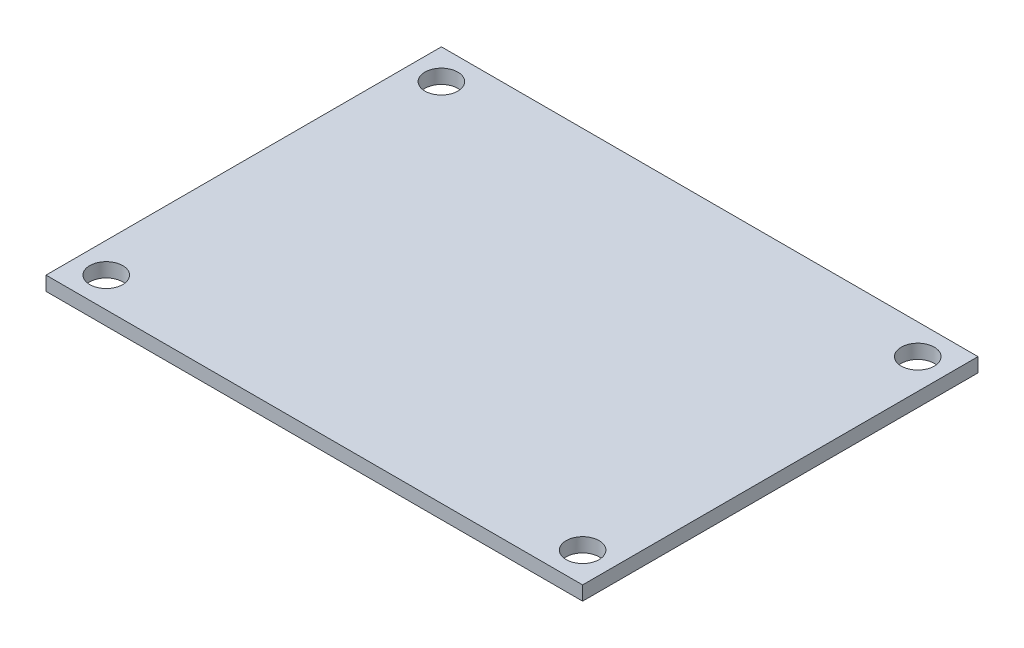
ISO-10303-21;
HEADER;
FILE_DESCRIPTION(('STEP AP214'),'2;1');
FILE_NAME('part.step','',(''),(''),'','','');
FILE_SCHEMA(('AUTOMOTIVE_DESIGN { 1 0 10303 214 1 1 1 1 }'));
ENDSEC;
DATA;
#1=APPLICATION_CONTEXT('core data for automotive mechanical design processes');
#2=APPLICATION_PROTOCOL_DEFINITION('international standard','automotive_design',2000,#1);
#3=PRODUCT_CONTEXT('',#1,'mechanical');
#4=PRODUCT('Part','Part','',(#3));
#5=PRODUCT_RELATED_PRODUCT_CATEGORY('part','',(#4));
#6=PRODUCT_DEFINITION_FORMATION('','',#4);
#7=PRODUCT_DEFINITION_CONTEXT('part definition',#1,'design');
#8=PRODUCT_DEFINITION('design','',#6,#7);
#9=PRODUCT_DEFINITION_SHAPE('','',#8);
#10=(LENGTH_UNIT() NAMED_UNIT(*) SI_UNIT(.MILLI.,.METRE.));
#11=(NAMED_UNIT(*) PLANE_ANGLE_UNIT() SI_UNIT($,.RADIAN.));
#12=(NAMED_UNIT(*) SI_UNIT($,.STERADIAN.) SOLID_ANGLE_UNIT());
#13=UNCERTAINTY_MEASURE_WITH_UNIT(LENGTH_MEASURE(1.E-05),#10,'distance_accuracy_value','');
#14=(GEOMETRIC_REPRESENTATION_CONTEXT(3) GLOBAL_UNCERTAINTY_ASSIGNED_CONTEXT((#13)) GLOBAL_UNIT_ASSIGNED_CONTEXT((#10,
#11,#12)) REPRESENTATION_CONTEXT('',''));
#15=CARTESIAN_POINT('',(0.,0.,0.));
#16=DIRECTION('',(0.,0.,1.));
#17=DIRECTION('',(1.,0.,0.));
#18=AXIS2_PLACEMENT_3D('',#15,#16,#17);
#19=CARTESIAN_POINT('',(28.5,1.5,21.));
#20=DIRECTION('',(-1.,0.,0.));
#21=DIRECTION('',(0.,0.,1.));
#22=AXIS2_PLACEMENT_3D('',#19,#20,#21);
#23=PLANE('',#22);
#24=DIRECTION('',(0.,0.,-1.));
#25=VECTOR('',#24,1.);
#26=CARTESIAN_POINT('',(28.5,0.,21.));
#27=LINE('',#26,#25);
#28=CARTESIAN_POINT('',(28.5,0.,21.));
#29=VERTEX_POINT('',#28);
#30=CARTESIAN_POINT('',(28.5,0.,-21.));
#31=VERTEX_POINT('',#30);
#32=EDGE_CURVE('E99',#29,#31,#27,.T.);
#33=ORIENTED_EDGE('',*,*,#32,.T.);
#34=DIRECTION('',(0.,-1.,0.));
#35=VECTOR('',#34,1.);
#36=CARTESIAN_POINT('',(28.5,1.5,-21.));
#37=LINE('',#36,#35);
#38=CARTESIAN_POINT('',(28.5,1.5,-21.));
#39=VERTEX_POINT('',#38);
#40=EDGE_CURVE('E11',#39,#31,#37,.T.);
#41=ORIENTED_EDGE('',*,*,#40,.F.);
#42=DIRECTION('',(0.,0.,-1.));
#43=VECTOR('',#42,1.);
#44=CARTESIAN_POINT('',(28.5,1.5,21.));
#45=LINE('',#44,#43);
#46=CARTESIAN_POINT('',(28.5,1.5,21.));
#47=VERTEX_POINT('',#46);
#48=EDGE_CURVE('E86',#47,#39,#45,.T.);
#49=ORIENTED_EDGE('',*,*,#48,.F.);
#50=DIRECTION('',(0.,-1.,0.));
#51=VECTOR('',#50,1.);
#52=CARTESIAN_POINT('',(28.5,1.5,21.));
#53=LINE('',#52,#51);
#54=EDGE_CURVE('E95',#47,#29,#53,.T.);
#55=ORIENTED_EDGE('',*,*,#54,.T.);
#56=EDGE_LOOP('',(#33,#41,#49,#55));
#57=FACE_BOUND('',#56,.T.);
#58=ADVANCED_FACE('F33',(#57),#23,.F.);
#59=CARTESIAN_POINT('',(-28.5,1.5,-21.));
#60=DIRECTION('',(0.,0.,1.));
#61=DIRECTION('',(1.,0.,0.));
#62=AXIS2_PLACEMENT_3D('',#59,#60,#61);
#63=PLANE('',#62);
#64=DIRECTION('',(-1.,0.,0.));
#65=VECTOR('',#64,1.);
#66=CARTESIAN_POINT('',(-28.5,0.,-21.));
#67=LINE('',#66,#65);
#68=CARTESIAN_POINT('',(-28.5,0.,-21.));
#69=VERTEX_POINT('',#68);
#70=EDGE_CURVE('E90',#31,#69,#67,.T.);
#71=ORIENTED_EDGE('',*,*,#70,.T.);
#72=DIRECTION('',(0.,-1.,0.));
#73=VECTOR('',#72,1.);
#74=CARTESIAN_POINT('',(-28.5,1.5,-21.));
#75=LINE('',#74,#73);
#76=CARTESIAN_POINT('',(-28.5,1.5,-21.));
#77=VERTEX_POINT('',#76);
#78=EDGE_CURVE('E42',#77,#69,#75,.T.);
#79=ORIENTED_EDGE('',*,*,#78,.F.);
#80=DIRECTION('',(-1.,0.,0.));
#81=VECTOR('',#80,1.);
#82=CARTESIAN_POINT('',(-28.5,1.5,-21.));
#83=LINE('',#82,#81);
#84=EDGE_CURVE('E81',#39,#77,#83,.T.);
#85=ORIENTED_EDGE('',*,*,#84,.F.);
#86=ORIENTED_EDGE('',*,*,#40,.T.);
#87=EDGE_LOOP('',(#71,#79,#85,#86));
#88=FACE_BOUND('',#87,.T.);
#89=ADVANCED_FACE('F89',(#88),#63,.F.);
#90=CARTESIAN_POINT('',(-28.5,1.5,21.));
#91=DIRECTION('',(1.,0.,0.));
#92=DIRECTION('',(0.,0.,-1.));
#93=AXIS2_PLACEMENT_3D('',#90,#91,#92);
#94=PLANE('',#93);
#95=DIRECTION('',(0.,0.,1.));
#96=VECTOR('',#95,1.);
#97=CARTESIAN_POINT('',(-28.5,0.,21.));
#98=LINE('',#97,#96);
#99=CARTESIAN_POINT('',(-28.5,0.,21.));
#100=VERTEX_POINT('',#99);
#101=EDGE_CURVE('E68',#69,#100,#98,.T.);
#102=ORIENTED_EDGE('',*,*,#101,.T.);
#103=DIRECTION('',(0.,-1.,0.));
#104=VECTOR('',#103,1.);
#105=CARTESIAN_POINT('',(-28.5,1.5,21.));
#106=LINE('',#105,#104);
#107=CARTESIAN_POINT('',(-28.5,1.5,21.));
#108=VERTEX_POINT('',#107);
#109=EDGE_CURVE('E91',#108,#100,#106,.T.);
#110=ORIENTED_EDGE('',*,*,#109,.F.);
#111=DIRECTION('',(0.,0.,1.));
#112=VECTOR('',#111,1.);
#113=CARTESIAN_POINT('',(-28.5,1.5,21.));
#114=LINE('',#113,#112);
#115=EDGE_CURVE('E84',#77,#108,#114,.T.);
#116=ORIENTED_EDGE('',*,*,#115,.F.);
#117=ORIENTED_EDGE('',*,*,#78,.T.);
#118=EDGE_LOOP('',(#102,#110,#116,#117));
#119=FACE_BOUND('',#118,.T.);
#120=ADVANCED_FACE('F93',(#119),#94,.F.);
#121=CARTESIAN_POINT('',(-28.5,1.5,21.));
#122=DIRECTION('',(0.,0.,-1.));
#123=DIRECTION('',(-1.,0.,0.));
#124=AXIS2_PLACEMENT_3D('',#121,#122,#123);
#125=PLANE('',#124);
#126=DIRECTION('',(1.,0.,0.));
#127=VECTOR('',#126,1.);
#128=CARTESIAN_POINT('',(-28.5,0.,21.));
#129=LINE('',#128,#127);
#130=EDGE_CURVE('E74',#100,#29,#129,.T.);
#131=ORIENTED_EDGE('',*,*,#130,.T.);
#132=ORIENTED_EDGE('',*,*,#54,.F.);
#133=DIRECTION('',(1.,0.,0.));
#134=VECTOR('',#133,1.);
#135=CARTESIAN_POINT('',(-28.5,1.5,21.));
#136=LINE('',#135,#134);
#137=EDGE_CURVE('E51',#108,#47,#136,.T.);
#138=ORIENTED_EDGE('',*,*,#137,.F.);
#139=ORIENTED_EDGE('',*,*,#109,.T.);
#140=EDGE_LOOP('',(#131,#132,#138,#139));
#141=FACE_BOUND('',#140,.T.);
#142=ADVANCED_FACE('F135',(#141),#125,.F.);
#143=CARTESIAN_POINT('',(0.,1.5,0.));
#144=DIRECTION('',(0.,-1.,0.));
#145=DIRECTION('',(0.,0.,-1.));
#146=AXIS2_PLACEMENT_3D('',#143,#144,#145);
#147=PLANE('',#146);
#148=CARTESIAN_POINT('',(-25.3,1.5,-17.8));
#149=DIRECTION('',(0.,1.,0.));
#150=DIRECTION('',(0.,0.,1.));
#151=AXIS2_PLACEMENT_3D('',#148,#149,#150);
#152=CIRCLE('',#151,1.75);
#153=CARTESIAN_POINT('',(-25.3,1.5,-16.05));
#154=VERTEX_POINT('',#153);
#155=EDGE_CURVE('E212',#154,#154,#152,.T.);
#156=ORIENTED_EDGE('',*,*,#155,.F.);
#157=EDGE_LOOP('',(#156));
#158=FACE_BOUND('',#157,.T.);
#159=CARTESIAN_POINT('',(25.3,1.5,17.8));
#160=DIRECTION('',(0.,1.,0.));
#161=DIRECTION('',(0.,0.,1.));
#162=AXIS2_PLACEMENT_3D('',#159,#160,#161);
#163=CIRCLE('',#162,1.75);
#164=CARTESIAN_POINT('',(25.3,1.5,19.55));
#165=VERTEX_POINT('',#164);
#166=EDGE_CURVE('E210',#165,#165,#163,.T.);
#167=ORIENTED_EDGE('',*,*,#166,.F.);
#168=EDGE_LOOP('',(#167));
#169=FACE_BOUND('',#168,.T.);
#170=CARTESIAN_POINT('',(25.3,1.5,-17.8));
#171=DIRECTION('',(0.,1.,0.));
#172=DIRECTION('',(0.,0.,1.));
#173=AXIS2_PLACEMENT_3D('',#170,#171,#172);
#174=CIRCLE('',#173,1.75);
#175=CARTESIAN_POINT('',(25.3,1.5,-16.05));
#176=VERTEX_POINT('',#175);
#177=EDGE_CURVE('E213',#176,#176,#174,.T.);
#178=ORIENTED_EDGE('',*,*,#177,.F.);
#179=EDGE_LOOP('',(#178));
#180=FACE_BOUND('',#179,.T.);
#181=CARTESIAN_POINT('',(-25.3,1.5,17.8));
#182=DIRECTION('',(0.,1.,0.));
#183=DIRECTION('',(0.,0.,1.));
#184=AXIS2_PLACEMENT_3D('',#181,#182,#183);
#185=CIRCLE('',#184,1.75);
#186=CARTESIAN_POINT('',(-25.3,1.5,19.55));
#187=VERTEX_POINT('',#186);
#188=EDGE_CURVE('E111',#187,#187,#185,.T.);
#189=ORIENTED_EDGE('',*,*,#188,.F.);
#190=EDGE_LOOP('',(#189));
#191=FACE_BOUND('',#190,.T.);
#192=ORIENTED_EDGE('',*,*,#48,.T.);
#193=ORIENTED_EDGE('',*,*,#84,.T.);
#194=ORIENTED_EDGE('',*,*,#115,.T.);
#195=ORIENTED_EDGE('',*,*,#137,.T.);
#196=EDGE_LOOP('',(#192,#193,#194,#195));
#197=FACE_BOUND('',#196,.T.);
#198=ADVANCED_FACE('F82',(#158,#169,#180,#191,#197),#147,.F.);
#199=CARTESIAN_POINT('',(0.,0.,0.));
#200=DIRECTION('',(0.,-1.,0.));
#201=DIRECTION('',(0.,0.,-1.));
#202=AXIS2_PLACEMENT_3D('',#199,#200,#201);
#203=PLANE('',#202);
#204=CARTESIAN_POINT('',(-25.3,0.,-17.8));
#205=DIRECTION('',(0.,-1.,0.));
#206=DIRECTION('',(0.,0.,-1.));
#207=AXIS2_PLACEMENT_3D('',#204,#205,#206);
#208=CIRCLE('',#207,1.75);
#209=CARTESIAN_POINT('',(-25.3,0.,-19.55));
#210=VERTEX_POINT('',#209);
#211=EDGE_CURVE('E36',#210,#210,#208,.T.);
#212=ORIENTED_EDGE('',*,*,#211,.F.);
#213=EDGE_LOOP('',(#212));
#214=FACE_BOUND('',#213,.T.);
#215=CARTESIAN_POINT('',(25.3,0.,17.8));
#216=DIRECTION('',(0.,-1.,0.));
#217=DIRECTION('',(0.,0.,-1.));
#218=AXIS2_PLACEMENT_3D('',#215,#216,#217);
#219=CIRCLE('',#218,1.75);
#220=CARTESIAN_POINT('',(25.3,0.,16.05));
#221=VERTEX_POINT('',#220);
#222=EDGE_CURVE('E113',#221,#221,#219,.T.);
#223=ORIENTED_EDGE('',*,*,#222,.F.);
#224=EDGE_LOOP('',(#223));
#225=FACE_BOUND('',#224,.T.);
#226=CARTESIAN_POINT('',(25.3,0.,-17.8));
#227=DIRECTION('',(0.,-1.,0.));
#228=DIRECTION('',(0.,0.,-1.));
#229=AXIS2_PLACEMENT_3D('',#226,#227,#228);
#230=CIRCLE('',#229,1.75);
#231=CARTESIAN_POINT('',(25.3,0.,-19.55));
#232=VERTEX_POINT('',#231);
#233=EDGE_CURVE('E110',#232,#232,#230,.T.);
#234=ORIENTED_EDGE('',*,*,#233,.F.);
#235=EDGE_LOOP('',(#234));
#236=FACE_BOUND('',#235,.T.);
#237=CARTESIAN_POINT('',(-25.3,0.,17.8));
#238=DIRECTION('',(0.,-1.,0.));
#239=DIRECTION('',(0.,0.,-1.));
#240=AXIS2_PLACEMENT_3D('',#237,#238,#239);
#241=CIRCLE('',#240,1.75);
#242=CARTESIAN_POINT('',(-25.3,0.,16.05));
#243=VERTEX_POINT('',#242);
#244=EDGE_CURVE('E107',#243,#243,#241,.T.);
#245=ORIENTED_EDGE('',*,*,#244,.F.);
#246=EDGE_LOOP('',(#245));
#247=FACE_BOUND('',#246,.T.);
#248=ORIENTED_EDGE('',*,*,#32,.F.);
#249=ORIENTED_EDGE('',*,*,#130,.F.);
#250=ORIENTED_EDGE('',*,*,#101,.F.);
#251=ORIENTED_EDGE('',*,*,#70,.F.);
#252=EDGE_LOOP('',(#248,#249,#250,#251));
#253=FACE_BOUND('',#252,.T.);
#254=ADVANCED_FACE('F123',(#214,#225,#236,#247,#253),#203,.T.);
#255=CARTESIAN_POINT('',(-25.3,-8.5,17.8));
#256=DIRECTION('',(0.,1.,0.));
#257=DIRECTION('',(0.,0.,1.));
#258=AXIS2_PLACEMENT_3D('',#255,#256,#257);
#259=CYLINDRICAL_SURFACE('',#258,1.75);
#260=ORIENTED_EDGE('',*,*,#244,.T.);
#261=EDGE_LOOP('',(#260));
#262=FACE_BOUND('',#261,.T.);
#263=ORIENTED_EDGE('',*,*,#188,.T.);
#264=EDGE_LOOP('',(#263));
#265=FACE_BOUND('',#264,.T.);
#266=ADVANCED_FACE('F126',(#262,#265),#259,.F.);
#267=CARTESIAN_POINT('',(25.3,-8.5,-17.8));
#268=DIRECTION('',(0.,1.,0.));
#269=DIRECTION('',(0.,0.,1.));
#270=AXIS2_PLACEMENT_3D('',#267,#268,#269);
#271=CYLINDRICAL_SURFACE('',#270,1.75);
#272=ORIENTED_EDGE('',*,*,#233,.T.);
#273=EDGE_LOOP('',(#272));
#274=FACE_BOUND('',#273,.T.);
#275=ORIENTED_EDGE('',*,*,#177,.T.);
#276=EDGE_LOOP('',(#275));
#277=FACE_BOUND('',#276,.T.);
#278=ADVANCED_FACE('F176',(#274,#277),#271,.F.);
#279=CARTESIAN_POINT('',(25.3,-8.5,17.8));
#280=DIRECTION('',(0.,1.,0.));
#281=DIRECTION('',(0.,0.,1.));
#282=AXIS2_PLACEMENT_3D('',#279,#280,#281);
#283=CYLINDRICAL_SURFACE('',#282,1.75);
#284=ORIENTED_EDGE('',*,*,#222,.T.);
#285=EDGE_LOOP('',(#284));
#286=FACE_BOUND('',#285,.T.);
#287=ORIENTED_EDGE('',*,*,#166,.T.);
#288=EDGE_LOOP('',(#287));
#289=FACE_BOUND('',#288,.T.);
#290=ADVANCED_FACE('F186',(#286,#289),#283,.F.);
#291=CARTESIAN_POINT('',(-25.3,-8.5,-17.8));
#292=DIRECTION('',(0.,1.,0.));
#293=DIRECTION('',(0.,0.,1.));
#294=AXIS2_PLACEMENT_3D('',#291,#292,#293);
#295=CYLINDRICAL_SURFACE('',#294,1.75);
#296=ORIENTED_EDGE('',*,*,#211,.T.);
#297=EDGE_LOOP('',(#296));
#298=FACE_BOUND('',#297,.T.);
#299=ORIENTED_EDGE('',*,*,#155,.T.);
#300=EDGE_LOOP('',(#299));
#301=FACE_BOUND('',#300,.T.);
#302=ADVANCED_FACE('F120',(#298,#301),#295,.F.);
#303=CLOSED_SHELL('',(#58,#89,#120,#142,#198,#254,#266,#278,#290,#302));
#304=MANIFOLD_SOLID_BREP('B2',#303);
#305=ADVANCED_BREP_SHAPE_REPRESENTATION('',(#18,#304),#14);
#306=SHAPE_DEFINITION_REPRESENTATION(#9,#305);
ENDSEC;
END-ISO-10303-21;
